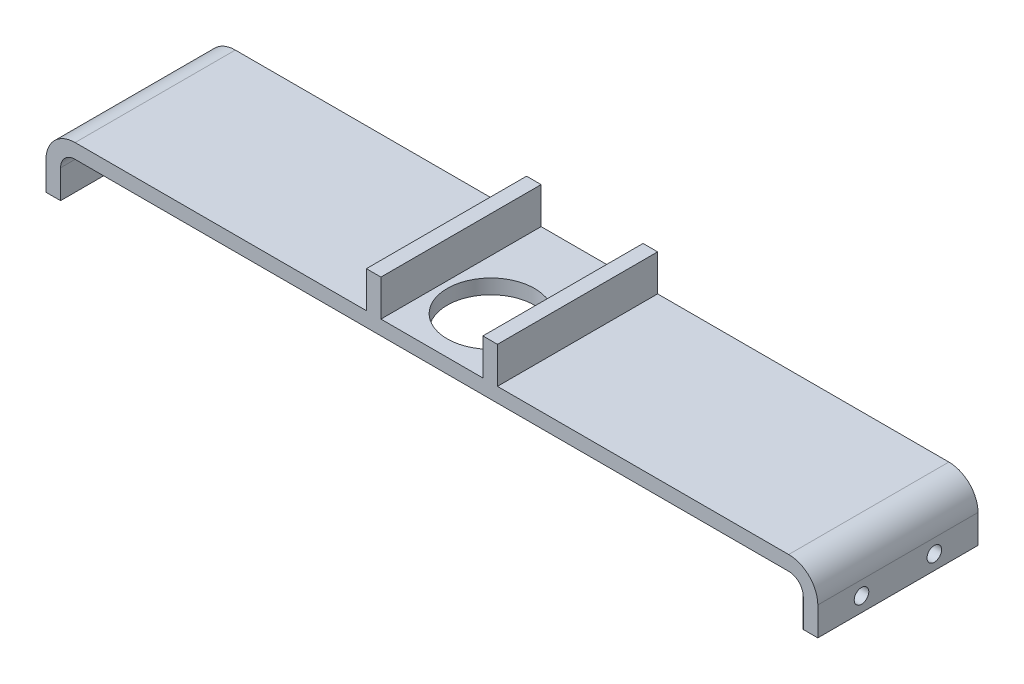
ISO-10303-21;
HEADER;
FILE_DESCRIPTION(('STEP AP214'),'2;1');
FILE_NAME('part.step','',(''),(''),'','','');
FILE_SCHEMA(('AUTOMOTIVE_DESIGN { 1 0 10303 214 1 1 1 1 }'));
ENDSEC;
DATA;
#1=APPLICATION_CONTEXT('core data for automotive mechanical design processes');
#2=APPLICATION_PROTOCOL_DEFINITION('international standard','automotive_design',2000,#1);
#3=PRODUCT_CONTEXT('',#1,'mechanical');
#4=PRODUCT('Part','Part','',(#3));
#5=PRODUCT_RELATED_PRODUCT_CATEGORY('part','',(#4));
#6=PRODUCT_DEFINITION_FORMATION('','',#4);
#7=PRODUCT_DEFINITION_CONTEXT('part definition',#1,'design');
#8=PRODUCT_DEFINITION('design','',#6,#7);
#9=PRODUCT_DEFINITION_SHAPE('','',#8);
#10=(LENGTH_UNIT() NAMED_UNIT(*) SI_UNIT(.MILLI.,.METRE.));
#11=(NAMED_UNIT(*) PLANE_ANGLE_UNIT() SI_UNIT($,.RADIAN.));
#12=(NAMED_UNIT(*) SI_UNIT($,.STERADIAN.) SOLID_ANGLE_UNIT());
#13=UNCERTAINTY_MEASURE_WITH_UNIT(LENGTH_MEASURE(1.E-05),#10,'distance_accuracy_value','');
#14=(GEOMETRIC_REPRESENTATION_CONTEXT(3) GLOBAL_UNCERTAINTY_ASSIGNED_CONTEXT((#13)) GLOBAL_UNIT_ASSIGNED_CONTEXT((#10,
#11,#12)) REPRESENTATION_CONTEXT('',''));
#15=CARTESIAN_POINT('',(0.,0.,0.));
#16=DIRECTION('',(0.,0.,1.));
#17=DIRECTION('',(1.,0.,0.));
#18=AXIS2_PLACEMENT_3D('',#15,#16,#17);
#19=CARTESIAN_POINT('',(0.,39.6,110.));
#20=DIRECTION('',(0.,1.,0.));
#21=DIRECTION('',(0.,0.,1.));
#22=AXIS2_PLACEMENT_3D('',#19,#20,#21);
#23=PLANE('',#22);
#24=DIRECTION('',(1.,0.,0.));
#25=VECTOR('',#24,1.);
#26=CARTESIAN_POINT('',(0.,39.6,110.));
#27=LINE('',#26,#25);
#28=CARTESIAN_POINT('',(20.,39.6,110.));
#29=VERTEX_POINT('',#28);
#30=CARTESIAN_POINT('',(220.,39.6,110.));
#31=VERTEX_POINT('',#30);
#32=EDGE_CURVE('E273',#29,#31,#27,.T.);
#33=ORIENTED_EDGE('',*,*,#32,.T.);
#34=DIRECTION('',(0.,0.,1.));
#35=VECTOR('',#34,1.);
#36=CARTESIAN_POINT('',(220.,39.6,0.));
#37=LINE('',#36,#35);
#38=CARTESIAN_POINT('',(220.,39.6,0.));
#39=VERTEX_POINT('',#38);
#40=EDGE_CURVE('E230',#39,#31,#37,.T.);
#41=ORIENTED_EDGE('',*,*,#40,.F.);
#42=DIRECTION('',(1.,0.,0.));
#43=VECTOR('',#42,1.);
#44=CARTESIAN_POINT('',(0.,39.6,0.));
#45=LINE('',#44,#43);
#46=CARTESIAN_POINT('',(20.,39.6,0.));
#47=VERTEX_POINT('',#46);
#48=EDGE_CURVE('E206',#47,#39,#45,.T.);
#49=ORIENTED_EDGE('',*,*,#48,.F.);
#50=DIRECTION('',(0.,0.,-1.));
#51=VECTOR('',#50,1.);
#52=CARTESIAN_POINT('',(20.,39.6,110.));
#53=LINE('',#52,#51);
#54=EDGE_CURVE('E331',#29,#47,#53,.T.);
#55=ORIENTED_EDGE('',*,*,#54,.F.);
#56=EDGE_LOOP('',(#33,#41,#49,#55));
#57=FACE_BOUND('',#56,.T.);
#58=ADVANCED_FACE('F43',(#57),#23,.T.);
#59=CARTESIAN_POINT('',(264.500885843374,39.6,69.));
#60=DIRECTION('',(0.,1.,0.));
#61=DIRECTION('',(0.,0.,1.));
#62=AXIS2_PLACEMENT_3D('',#59,#60,#61);
#63=CIRCLE('',#62,30.);
#64=CARTESIAN_POINT('',(264.500885843374,39.6,99.0000000000001));
#65=VERTEX_POINT('',#64);
#66=EDGE_CURVE('E519',#65,#65,#63,.T.);
#67=ORIENTED_EDGE('',*,*,#66,.F.);
#68=EDGE_LOOP('',(#67));
#69=FACE_BOUND('',#68,.T.);
#70=CARTESIAN_POINT('',(230.,39.6,0.));
#71=VERTEX_POINT('',#70);
#72=CARTESIAN_POINT('',(300.,39.6,0.));
#73=VERTEX_POINT('',#72);
#74=EDGE_CURVE('E308',#71,#73,#45,.T.);
#75=ORIENTED_EDGE('',*,*,#74,.F.);
#76=DIRECTION('',(0.,0.,-1.));
#77=VECTOR('',#76,1.);
#78=CARTESIAN_POINT('',(230.,39.6,0.));
#79=LINE('',#78,#77);
#80=CARTESIAN_POINT('',(230.,39.6,110.));
#81=VERTEX_POINT('',#80);
#82=EDGE_CURVE('E199',#81,#71,#79,.T.);
#83=ORIENTED_EDGE('',*,*,#82,.F.);
#84=CARTESIAN_POINT('',(300.,39.6,110.));
#85=VERTEX_POINT('',#84);
#86=EDGE_CURVE('E277',#81,#85,#27,.T.);
#87=ORIENTED_EDGE('',*,*,#86,.T.);
#88=DIRECTION('',(0.,0.,-1.));
#89=VECTOR('',#88,1.);
#90=CARTESIAN_POINT('',(300.,39.6,110.));
#91=LINE('',#90,#89);
#92=EDGE_CURVE('E225',#85,#73,#91,.T.);
#93=ORIENTED_EDGE('',*,*,#92,.T.);
#94=EDGE_LOOP('',(#75,#83,#87,#93));
#95=FACE_BOUND('',#94,.T.);
#96=ADVANCED_FACE('F397',(#69,#95),#23,.T.);
#97=DIRECTION('',(0.,0.,1.));
#98=VECTOR('',#97,1.);
#99=CARTESIAN_POINT('',(310.,39.6,0.));
#100=LINE('',#99,#98);
#101=CARTESIAN_POINT('',(310.,39.6,0.));
#102=VERTEX_POINT('',#101);
#103=CARTESIAN_POINT('',(310.,39.6,110.));
#104=VERTEX_POINT('',#103);
#105=EDGE_CURVE('E60',#102,#104,#100,.T.);
#106=ORIENTED_EDGE('',*,*,#105,.T.);
#107=CARTESIAN_POINT('',(510.,39.6,110.));
#108=VERTEX_POINT('',#107);
#109=EDGE_CURVE('E272',#104,#108,#27,.T.);
#110=ORIENTED_EDGE('',*,*,#109,.T.);
#111=DIRECTION('',(0.,0.,-1.));
#112=VECTOR('',#111,1.);
#113=CARTESIAN_POINT('',(510.,39.6,110.));
#114=LINE('',#113,#112);
#115=CARTESIAN_POINT('',(510.,39.6,0.));
#116=VERTEX_POINT('',#115);
#117=EDGE_CURVE('E333',#108,#116,#114,.T.);
#118=ORIENTED_EDGE('',*,*,#117,.T.);
#119=EDGE_CURVE('E305',#102,#116,#45,.T.);
#120=ORIENTED_EDGE('',*,*,#119,.F.);
#121=EDGE_LOOP('',(#106,#110,#118,#120));
#122=FACE_BOUND('',#121,.T.);
#123=ADVANCED_FACE('F403',(#122),#23,.T.);
#124=CARTESIAN_POINT('',(0.,29.6,110.));
#125=DIRECTION('',(0.,1.,0.));
#126=DIRECTION('',(0.,0.,1.));
#127=AXIS2_PLACEMENT_3D('',#124,#125,#126);
#128=PLANE('',#127);
#129=CARTESIAN_POINT('',(264.500885843374,29.6,69.));
#130=DIRECTION('',(0.,1.,0.));
#131=DIRECTION('',(0.,0.,1.));
#132=AXIS2_PLACEMENT_3D('',#129,#130,#131);
#133=CIRCLE('',#132,30.);
#134=CARTESIAN_POINT('',(264.500885843374,29.6,99.0000000000001));
#135=VERTEX_POINT('',#134);
#136=EDGE_CURVE('E47',#135,#135,#133,.T.);
#137=ORIENTED_EDGE('',*,*,#136,.T.);
#138=EDGE_LOOP('',(#137));
#139=FACE_BOUND('',#138,.T.);
#140=DIRECTION('',(1.,0.,0.));
#141=VECTOR('',#140,1.);
#142=CARTESIAN_POINT('',(0.,29.6,0.));
#143=LINE('',#142,#141);
#144=CARTESIAN_POINT('',(20.,29.6,0.));
#145=VERTEX_POINT('',#144);
#146=CARTESIAN_POINT('',(510.,29.6,0.));
#147=VERTEX_POINT('',#146);
#148=EDGE_CURVE('E256',#145,#147,#143,.T.);
#149=ORIENTED_EDGE('',*,*,#148,.T.);
#150=DIRECTION('',(0.,0.,-1.));
#151=VECTOR('',#150,1.);
#152=CARTESIAN_POINT('',(510.,29.6,110.));
#153=LINE('',#152,#151);
#154=CARTESIAN_POINT('',(510.,29.6,110.));
#155=VERTEX_POINT('',#154);
#156=EDGE_CURVE('E11',#155,#147,#153,.T.);
#157=ORIENTED_EDGE('',*,*,#156,.F.);
#158=DIRECTION('',(1.,0.,0.));
#159=VECTOR('',#158,1.);
#160=CARTESIAN_POINT('',(0.,29.6,110.));
#161=LINE('',#160,#159);
#162=CARTESIAN_POINT('',(20.,29.6,110.));
#163=VERTEX_POINT('',#162);
#164=EDGE_CURVE('E257',#163,#155,#161,.T.);
#165=ORIENTED_EDGE('',*,*,#164,.F.);
#166=DIRECTION('',(0.,0.,-1.));
#167=VECTOR('',#166,1.);
#168=CARTESIAN_POINT('',(20.,29.6,110.));
#169=LINE('',#168,#167);
#170=EDGE_CURVE('E290',#163,#145,#169,.T.);
#171=ORIENTED_EDGE('',*,*,#170,.T.);
#172=EDGE_LOOP('',(#149,#157,#165,#171));
#173=FACE_BOUND('',#172,.T.);
#174=ADVANCED_FACE('F45',(#139,#173),#128,.F.);
#175=CARTESIAN_POINT('',(510.,19.6,110.));
#176=DIRECTION('',(0.,0.,-1.));
#177=DIRECTION('',(-1.,0.,0.));
#178=AXIS2_PLACEMENT_3D('',#175,#176,#177);
#179=CYLINDRICAL_SURFACE('',#178,10.);
#180=CARTESIAN_POINT('',(510.,19.6,0.));
#181=DIRECTION('',(0.,0.,1.));
#182=DIRECTION('',(1.,0.,0.));
#183=AXIS2_PLACEMENT_3D('',#180,#181,#182);
#184=CIRCLE('',#183,10.);
#185=CARTESIAN_POINT('',(520.,19.6,0.));
#186=VERTEX_POINT('',#185);
#187=EDGE_CURVE('E293',#147,#186,#184,.F.);
#188=ORIENTED_EDGE('',*,*,#187,.T.);
#189=DIRECTION('',(0.,0.,-1.));
#190=VECTOR('',#189,1.);
#191=CARTESIAN_POINT('',(520.,19.6,110.));
#192=LINE('',#191,#190);
#193=CARTESIAN_POINT('',(520.,19.6,110.));
#194=VERTEX_POINT('',#193);
#195=EDGE_CURVE('E52',#194,#186,#192,.T.);
#196=ORIENTED_EDGE('',*,*,#195,.F.);
#197=CARTESIAN_POINT('',(510.,19.6,110.));
#198=DIRECTION('',(0.,0.,1.));
#199=DIRECTION('',(1.,0.,0.));
#200=AXIS2_PLACEMENT_3D('',#197,#198,#199);
#201=CIRCLE('',#200,10.);
#202=EDGE_CURVE('E260',#155,#194,#201,.F.);
#203=ORIENTED_EDGE('',*,*,#202,.F.);
#204=ORIENTED_EDGE('',*,*,#156,.T.);
#205=EDGE_LOOP('',(#188,#196,#203,#204));
#206=FACE_BOUND('',#205,.T.);
#207=ADVANCED_FACE('F452',(#206),#179,.F.);
#208=CARTESIAN_POINT('',(520.,0.,110.));
#209=DIRECTION('',(1.,0.,0.));
#210=DIRECTION('',(0.,0.,-1.));
#211=AXIS2_PLACEMENT_3D('',#208,#209,#210);
#212=PLANE('',#211);
#213=CARTESIAN_POINT('',(520.,9.99999999999999,30.));
#214=DIRECTION('',(1.,0.,0.));
#215=DIRECTION('',(0.,0.,-1.));
#216=AXIS2_PLACEMENT_3D('',#213,#214,#215);
#217=CIRCLE('',#216,5.);
#218=CARTESIAN_POINT('',(520.,9.99999999999999,25.));
#219=VERTEX_POINT('',#218);
#220=EDGE_CURVE('E253',#219,#219,#217,.T.);
#221=ORIENTED_EDGE('',*,*,#220,.T.);
#222=EDGE_LOOP('',(#221));
#223=FACE_BOUND('',#222,.T.);
#224=CARTESIAN_POINT('',(520.,9.99999999999999,80.));
#225=DIRECTION('',(1.,0.,0.));
#226=DIRECTION('',(0.,0.,-1.));
#227=AXIS2_PLACEMENT_3D('',#224,#225,#226);
#228=CIRCLE('',#227,4.99999999999999);
#229=CARTESIAN_POINT('',(520.,9.99999999999999,75.));
#230=VERTEX_POINT('',#229);
#231=EDGE_CURVE('E249',#230,#230,#228,.T.);
#232=ORIENTED_EDGE('',*,*,#231,.T.);
#233=EDGE_LOOP('',(#232));
#234=FACE_BOUND('',#233,.T.);
#235=DIRECTION('',(0.,-1.,0.));
#236=VECTOR('',#235,1.);
#237=CARTESIAN_POINT('',(520.,0.,0.));
#238=LINE('',#237,#236);
#239=CARTESIAN_POINT('',(520.,0.,0.));
#240=VERTEX_POINT('',#239);
#241=EDGE_CURVE('E295',#186,#240,#238,.T.);
#242=ORIENTED_EDGE('',*,*,#241,.T.);
#243=DIRECTION('',(0.,0.,-1.));
#244=VECTOR('',#243,1.);
#245=CARTESIAN_POINT('',(520.,0.,110.));
#246=LINE('',#245,#244);
#247=CARTESIAN_POINT('',(520.,0.,110.));
#248=VERTEX_POINT('',#247);
#249=EDGE_CURVE('E341',#248,#240,#246,.T.);
#250=ORIENTED_EDGE('',*,*,#249,.F.);
#251=DIRECTION('',(0.,-1.,0.));
#252=VECTOR('',#251,1.);
#253=CARTESIAN_POINT('',(520.,0.,110.));
#254=LINE('',#253,#252);
#255=EDGE_CURVE('E263',#194,#248,#254,.T.);
#256=ORIENTED_EDGE('',*,*,#255,.F.);
#257=ORIENTED_EDGE('',*,*,#195,.T.);
#258=EDGE_LOOP('',(#242,#250,#256,#257));
#259=FACE_BOUND('',#258,.T.);
#260=ADVANCED_FACE('F458',(#223,#234,#259),#212,.F.);
#261=CARTESIAN_POINT('',(0.,0.,110.));
#262=DIRECTION('',(0.,1.,0.));
#263=DIRECTION('',(0.,0.,1.));
#264=AXIS2_PLACEMENT_3D('',#261,#262,#263);
#265=PLANE('',#264);
#266=DIRECTION('',(1.,0.,0.));
#267=VECTOR('',#266,1.);
#268=CARTESIAN_POINT('',(0.,0.,0.));
#269=LINE('',#268,#267);
#270=CARTESIAN_POINT('',(530.,0.,0.));
#271=VERTEX_POINT('',#270);
#272=EDGE_CURVE('E297',#240,#271,#269,.T.);
#273=ORIENTED_EDGE('',*,*,#272,.T.);
#274=DIRECTION('',(0.,0.,-1.));
#275=VECTOR('',#274,1.);
#276=CARTESIAN_POINT('',(530.,0.,110.));
#277=LINE('',#276,#275);
#278=CARTESIAN_POINT('',(530.,0.,110.));
#279=VERTEX_POINT('',#278);
#280=EDGE_CURVE('E338',#279,#271,#277,.T.);
#281=ORIENTED_EDGE('',*,*,#280,.F.);
#282=DIRECTION('',(1.,0.,0.));
#283=VECTOR('',#282,1.);
#284=CARTESIAN_POINT('',(0.,0.,110.));
#285=LINE('',#284,#283);
#286=EDGE_CURVE('E265',#248,#279,#285,.T.);
#287=ORIENTED_EDGE('',*,*,#286,.F.);
#288=ORIENTED_EDGE('',*,*,#249,.T.);
#289=EDGE_LOOP('',(#273,#281,#287,#288));
#290=FACE_BOUND('',#289,.T.);
#291=ADVANCED_FACE('F469',(#290),#265,.F.);
#292=CARTESIAN_POINT('',(530.,0.,110.));
#293=DIRECTION('',(-1.,0.,0.));
#294=DIRECTION('',(0.,0.,1.));
#295=AXIS2_PLACEMENT_3D('',#292,#293,#294);
#296=PLANE('',#295);
#297=CARTESIAN_POINT('',(530.,9.99999999999999,30.));
#298=DIRECTION('',(-1.,0.,0.));
#299=DIRECTION('',(0.,0.,1.));
#300=AXIS2_PLACEMENT_3D('',#297,#298,#299);
#301=CIRCLE('',#300,5.);
#302=CARTESIAN_POINT('',(530.,9.99999999999999,35.));
#303=VERTEX_POINT('',#302);
#304=EDGE_CURVE('E240',#303,#303,#301,.T.);
#305=ORIENTED_EDGE('',*,*,#304,.T.);
#306=EDGE_LOOP('',(#305));
#307=FACE_BOUND('',#306,.T.);
#308=CARTESIAN_POINT('',(530.,9.99999999999999,80.));
#309=DIRECTION('',(-1.,0.,0.));
#310=DIRECTION('',(0.,0.,-1.));
#311=AXIS2_PLACEMENT_3D('',#308,#309,#310);
#312=CIRCLE('',#311,4.99999999999999);
#313=CARTESIAN_POINT('',(530.,9.99999999999999,75.));
#314=VERTEX_POINT('',#313);
#315=EDGE_CURVE('E207',#314,#314,#312,.T.);
#316=ORIENTED_EDGE('',*,*,#315,.T.);
#317=EDGE_LOOP('',(#316));
#318=FACE_BOUND('',#317,.T.);
#319=DIRECTION('',(0.,1.,0.));
#320=VECTOR('',#319,1.);
#321=CARTESIAN_POINT('',(530.,0.,0.));
#322=LINE('',#321,#320);
#323=CARTESIAN_POINT('',(530.,19.6,0.));
#324=VERTEX_POINT('',#323);
#325=EDGE_CURVE('E299',#271,#324,#322,.T.);
#326=ORIENTED_EDGE('',*,*,#325,.T.);
#327=DIRECTION('',(0.,0.,-1.));
#328=VECTOR('',#327,1.);
#329=CARTESIAN_POINT('',(530.,19.6,110.));
#330=LINE('',#329,#328);
#331=CARTESIAN_POINT('',(530.,19.6,110.));
#332=VERTEX_POINT('',#331);
#333=EDGE_CURVE('E336',#332,#324,#330,.T.);
#334=ORIENTED_EDGE('',*,*,#333,.F.);
#335=DIRECTION('',(0.,1.,0.));
#336=VECTOR('',#335,1.);
#337=CARTESIAN_POINT('',(530.,0.,110.));
#338=LINE('',#337,#336);
#339=EDGE_CURVE('E267',#279,#332,#338,.T.);
#340=ORIENTED_EDGE('',*,*,#339,.F.);
#341=ORIENTED_EDGE('',*,*,#280,.T.);
#342=EDGE_LOOP('',(#326,#334,#340,#341));
#343=FACE_BOUND('',#342,.T.);
#344=ADVANCED_FACE('F415',(#307,#318,#343),#296,.F.);
#345=CARTESIAN_POINT('',(510.,19.6,110.));
#346=DIRECTION('',(0.,0.,-1.));
#347=DIRECTION('',(-1.,0.,0.));
#348=AXIS2_PLACEMENT_3D('',#345,#346,#347);
#349=CYLINDRICAL_SURFACE('',#348,20.);
#350=CARTESIAN_POINT('',(510.,19.6,0.));
#351=DIRECTION('',(0.,0.,1.));
#352=DIRECTION('',(1.,0.,0.));
#353=AXIS2_PLACEMENT_3D('',#350,#351,#352);
#354=CIRCLE('',#353,20.);
#355=EDGE_CURVE('E302',#116,#324,#354,.F.);
#356=ORIENTED_EDGE('',*,*,#355,.F.);
#357=ORIENTED_EDGE('',*,*,#117,.F.);
#358=CARTESIAN_POINT('',(510.,19.6,110.));
#359=DIRECTION('',(0.,0.,1.));
#360=DIRECTION('',(1.,0.,0.));
#361=AXIS2_PLACEMENT_3D('',#358,#359,#360);
#362=CIRCLE('',#361,20.);
#363=EDGE_CURVE('E269',#108,#332,#362,.F.);
#364=ORIENTED_EDGE('',*,*,#363,.T.);
#365=ORIENTED_EDGE('',*,*,#333,.T.);
#366=EDGE_LOOP('',(#356,#357,#364,#365));
#367=FACE_BOUND('',#366,.T.);
#368=ADVANCED_FACE('F409',(#367),#349,.T.);
#369=CARTESIAN_POINT('',(20.,19.6,110.));
#370=DIRECTION('',(0.,0.,-1.));
#371=DIRECTION('',(-1.,0.,0.));
#372=AXIS2_PLACEMENT_3D('',#369,#370,#371);
#373=CYLINDRICAL_SURFACE('',#372,20.);
#374=CARTESIAN_POINT('',(20.,19.6,0.));
#375=DIRECTION('',(0.,0.,1.));
#376=DIRECTION('',(1.,0.,0.));
#377=AXIS2_PLACEMENT_3D('',#374,#375,#376);
#378=CIRCLE('',#377,20.);
#379=CARTESIAN_POINT('',(0.,19.6,0.));
#380=VERTEX_POINT('',#379);
#381=EDGE_CURVE('E307',#47,#380,#378,.T.);
#382=ORIENTED_EDGE('',*,*,#381,.T.);
#383=DIRECTION('',(0.,0.,-1.));
#384=VECTOR('',#383,1.);
#385=CARTESIAN_POINT('',(0.,19.6,110.));
#386=LINE('',#385,#384);
#387=CARTESIAN_POINT('',(0.,19.6,110.));
#388=VERTEX_POINT('',#387);
#389=EDGE_CURVE('E329',#388,#380,#386,.T.);
#390=ORIENTED_EDGE('',*,*,#389,.F.);
#391=CARTESIAN_POINT('',(20.,19.6,110.));
#392=DIRECTION('',(0.,0.,1.));
#393=DIRECTION('',(1.,0.,0.));
#394=AXIS2_PLACEMENT_3D('',#391,#392,#393);
#395=CIRCLE('',#394,20.);
#396=EDGE_CURVE('E276',#29,#388,#395,.T.);
#397=ORIENTED_EDGE('',*,*,#396,.F.);
#398=ORIENTED_EDGE('',*,*,#54,.T.);
#399=EDGE_LOOP('',(#382,#390,#397,#398));
#400=FACE_BOUND('',#399,.T.);
#401=ADVANCED_FACE('F381',(#400),#373,.T.);
#402=CARTESIAN_POINT('',(0.,0.,110.));
#403=DIRECTION('',(-1.,0.,0.));
#404=DIRECTION('',(0.,0.,1.));
#405=AXIS2_PLACEMENT_3D('',#402,#403,#404);
#406=PLANE('',#405);
#407=CARTESIAN_POINT('',(0.,9.99999999999999,30.));
#408=DIRECTION('',(-1.,0.,0.));
#409=DIRECTION('',(0.,0.,1.));
#410=AXIS2_PLACEMENT_3D('',#407,#408,#409);
#411=CIRCLE('',#410,5.);
#412=CARTESIAN_POINT('',(0.,9.99999999999999,35.));
#413=VERTEX_POINT('',#412);
#414=EDGE_CURVE('E244',#413,#413,#411,.T.);
#415=ORIENTED_EDGE('',*,*,#414,.F.);
#416=EDGE_LOOP('',(#415));
#417=FACE_BOUND('',#416,.T.);
#418=CARTESIAN_POINT('',(0.,9.99999999999999,80.));
#419=DIRECTION('',(-1.,0.,0.));
#420=DIRECTION('',(0.,0.,-1.));
#421=AXIS2_PLACEMENT_3D('',#418,#419,#420);
#422=CIRCLE('',#421,4.99999999999999);
#423=CARTESIAN_POINT('',(0.,9.99999999999999,75.));
#424=VERTEX_POINT('',#423);
#425=EDGE_CURVE('E210',#424,#424,#422,.T.);
#426=ORIENTED_EDGE('',*,*,#425,.F.);
#427=EDGE_LOOP('',(#426));
#428=FACE_BOUND('',#427,.T.);
#429=DIRECTION('',(0.,1.,0.));
#430=VECTOR('',#429,1.);
#431=CARTESIAN_POINT('',(0.,0.,0.));
#432=LINE('',#431,#430);
#433=CARTESIAN_POINT('',(0.,0.,0.));
#434=VERTEX_POINT('',#433);
#435=EDGE_CURVE('E311',#434,#380,#432,.T.);
#436=ORIENTED_EDGE('',*,*,#435,.F.);
#437=DIRECTION('',(0.,0.,-1.));
#438=VECTOR('',#437,1.);
#439=CARTESIAN_POINT('',(0.,0.,110.));
#440=LINE('',#439,#438);
#441=CARTESIAN_POINT('',(0.,0.,110.));
#442=VERTEX_POINT('',#441);
#443=EDGE_CURVE('E327',#442,#434,#440,.T.);
#444=ORIENTED_EDGE('',*,*,#443,.F.);
#445=DIRECTION('',(0.,1.,0.));
#446=VECTOR('',#445,1.);
#447=CARTESIAN_POINT('',(0.,0.,110.));
#448=LINE('',#447,#446);
#449=EDGE_CURVE('E279',#442,#388,#448,.T.);
#450=ORIENTED_EDGE('',*,*,#449,.T.);
#451=ORIENTED_EDGE('',*,*,#389,.T.);
#452=EDGE_LOOP('',(#436,#444,#450,#451));
#453=FACE_BOUND('',#452,.T.);
#454=ADVANCED_FACE('F377',(#417,#428,#453),#406,.T.);
#455=CARTESIAN_POINT('',(0.,0.,110.));
#456=DIRECTION('',(0.,1.,0.));
#457=DIRECTION('',(0.,0.,1.));
#458=AXIS2_PLACEMENT_3D('',#455,#456,#457);
#459=PLANE('',#458);
#460=DIRECTION('',(1.,0.,0.));
#461=VECTOR('',#460,1.);
#462=CARTESIAN_POINT('',(0.,0.,0.));
#463=LINE('',#462,#461);
#464=CARTESIAN_POINT('',(10.,0.,0.));
#465=VERTEX_POINT('',#464);
#466=EDGE_CURVE('E314',#434,#465,#463,.T.);
#467=ORIENTED_EDGE('',*,*,#466,.T.);
#468=DIRECTION('',(0.,0.,-1.));
#469=VECTOR('',#468,1.);
#470=CARTESIAN_POINT('',(10.,0.,110.));
#471=LINE('',#470,#469);
#472=CARTESIAN_POINT('',(10.,0.,110.));
#473=VERTEX_POINT('',#472);
#474=EDGE_CURVE('E325',#473,#465,#471,.T.);
#475=ORIENTED_EDGE('',*,*,#474,.F.);
#476=DIRECTION('',(1.,0.,0.));
#477=VECTOR('',#476,1.);
#478=CARTESIAN_POINT('',(0.,0.,110.));
#479=LINE('',#478,#477);
#480=EDGE_CURVE('E282',#442,#473,#479,.T.);
#481=ORIENTED_EDGE('',*,*,#480,.F.);
#482=ORIENTED_EDGE('',*,*,#443,.T.);
#483=EDGE_LOOP('',(#467,#475,#481,#482));
#484=FACE_BOUND('',#483,.T.);
#485=ADVANCED_FACE('F357',(#484),#459,.F.);
#486=CARTESIAN_POINT('',(10.,0.,110.));
#487=DIRECTION('',(1.,0.,0.));
#488=DIRECTION('',(0.,0.,-1.));
#489=AXIS2_PLACEMENT_3D('',#486,#487,#488);
#490=PLANE('',#489);
#491=CARTESIAN_POINT('',(10.,9.99999999999999,30.));
#492=DIRECTION('',(1.,0.,0.));
#493=DIRECTION('',(0.,0.,-1.));
#494=AXIS2_PLACEMENT_3D('',#491,#492,#493);
#495=CIRCLE('',#494,5.);
#496=CARTESIAN_POINT('',(10.,9.99999999999999,25.));
#497=VERTEX_POINT('',#496);
#498=EDGE_CURVE('E252',#497,#497,#495,.T.);
#499=ORIENTED_EDGE('',*,*,#498,.F.);
#500=EDGE_LOOP('',(#499));
#501=FACE_BOUND('',#500,.T.);
#502=CARTESIAN_POINT('',(10.,9.99999999999999,80.));
#503=DIRECTION('',(1.,0.,0.));
#504=DIRECTION('',(0.,0.,-1.));
#505=AXIS2_PLACEMENT_3D('',#502,#503,#504);
#506=CIRCLE('',#505,4.99999999999999);
#507=CARTESIAN_POINT('',(10.,9.99999999999999,75.));
#508=VERTEX_POINT('',#507);
#509=EDGE_CURVE('E243',#508,#508,#506,.T.);
#510=ORIENTED_EDGE('',*,*,#509,.F.);
#511=EDGE_LOOP('',(#510));
#512=FACE_BOUND('',#511,.T.);
#513=DIRECTION('',(0.,-1.,0.));
#514=VECTOR('',#513,1.);
#515=CARTESIAN_POINT('',(10.,0.,0.));
#516=LINE('',#515,#514);
#517=CARTESIAN_POINT('',(10.,19.6,0.));
#518=VERTEX_POINT('',#517);
#519=EDGE_CURVE('E317',#518,#465,#516,.T.);
#520=ORIENTED_EDGE('',*,*,#519,.F.);
#521=DIRECTION('',(0.,0.,-1.));
#522=VECTOR('',#521,1.);
#523=CARTESIAN_POINT('',(10.,19.6,110.));
#524=LINE('',#523,#522);
#525=CARTESIAN_POINT('',(10.,19.6,110.));
#526=VERTEX_POINT('',#525);
#527=EDGE_CURVE('E323',#526,#518,#524,.T.);
#528=ORIENTED_EDGE('',*,*,#527,.F.);
#529=DIRECTION('',(0.,-1.,0.));
#530=VECTOR('',#529,1.);
#531=CARTESIAN_POINT('',(10.,0.,110.));
#532=LINE('',#531,#530);
#533=EDGE_CURVE('E284',#526,#473,#532,.T.);
#534=ORIENTED_EDGE('',*,*,#533,.T.);
#535=ORIENTED_EDGE('',*,*,#474,.T.);
#536=EDGE_LOOP('',(#520,#528,#534,#535));
#537=FACE_BOUND('',#536,.T.);
#538=ADVANCED_FACE('F353',(#501,#512,#537),#490,.T.);
#539=CARTESIAN_POINT('',(20.,19.6,110.));
#540=DIRECTION('',(0.,0.,-1.));
#541=DIRECTION('',(-1.,0.,0.));
#542=AXIS2_PLACEMENT_3D('',#539,#540,#541);
#543=CYLINDRICAL_SURFACE('',#542,10.);
#544=CARTESIAN_POINT('',(20.,19.6,0.));
#545=DIRECTION('',(0.,0.,1.));
#546=DIRECTION('',(1.,0.,0.));
#547=AXIS2_PLACEMENT_3D('',#544,#545,#546);
#548=CIRCLE('',#547,10.);
#549=EDGE_CURVE('E261',#145,#518,#548,.T.);
#550=ORIENTED_EDGE('',*,*,#549,.F.);
#551=ORIENTED_EDGE('',*,*,#170,.F.);
#552=CARTESIAN_POINT('',(20.,19.6,110.));
#553=DIRECTION('',(0.,0.,1.));
#554=DIRECTION('',(1.,0.,0.));
#555=AXIS2_PLACEMENT_3D('',#552,#553,#554);
#556=CIRCLE('',#555,10.);
#557=EDGE_CURVE('E287',#163,#526,#556,.T.);
#558=ORIENTED_EDGE('',*,*,#557,.T.);
#559=ORIENTED_EDGE('',*,*,#527,.T.);
#560=EDGE_LOOP('',(#550,#551,#558,#559));
#561=FACE_BOUND('',#560,.T.);
#562=ADVANCED_FACE('F356',(#561),#543,.F.);
#563=CARTESIAN_POINT('',(0.,0.,110.));
#564=DIRECTION('',(0.,0.,1.));
#565=DIRECTION('',(1.,0.,0.));
#566=AXIS2_PLACEMENT_3D('',#563,#564,#565);
#567=PLANE('',#566);
#568=ORIENTED_EDGE('',*,*,#164,.T.);
#569=ORIENTED_EDGE('',*,*,#202,.T.);
#570=ORIENTED_EDGE('',*,*,#255,.T.);
#571=ORIENTED_EDGE('',*,*,#286,.T.);
#572=ORIENTED_EDGE('',*,*,#339,.T.);
#573=ORIENTED_EDGE('',*,*,#363,.F.);
#574=ORIENTED_EDGE('',*,*,#109,.F.);
#575=DIRECTION('',(0.,-1.,0.));
#576=VECTOR('',#575,1.);
#577=CARTESIAN_POINT('',(310.,64.6,110.));
#578=LINE('',#577,#576);
#579=CARTESIAN_POINT('',(310.,64.6,110.));
#580=VERTEX_POINT('',#579);
#581=EDGE_CURVE('E216',#580,#104,#578,.T.);
#582=ORIENTED_EDGE('',*,*,#581,.F.);
#583=DIRECTION('',(1.,0.,0.));
#584=VECTOR('',#583,1.);
#585=CARTESIAN_POINT('',(300.,64.6,110.));
#586=LINE('',#585,#584);
#587=CARTESIAN_POINT('',(300.,64.6,110.));
#588=VERTEX_POINT('',#587);
#589=EDGE_CURVE('E228',#588,#580,#586,.T.);
#590=ORIENTED_EDGE('',*,*,#589,.F.);
#591=DIRECTION('',(0.,-1.,0.));
#592=VECTOR('',#591,1.);
#593=CARTESIAN_POINT('',(300.,64.6,110.));
#594=LINE('',#593,#592);
#595=EDGE_CURVE('E222',#588,#85,#594,.T.);
#596=ORIENTED_EDGE('',*,*,#595,.T.);
#597=ORIENTED_EDGE('',*,*,#86,.F.);
#598=DIRECTION('',(0.,-1.,0.));
#599=VECTOR('',#598,1.);
#600=CARTESIAN_POINT('',(230.,64.6,110.));
#601=LINE('',#600,#599);
#602=CARTESIAN_POINT('',(230.,64.6,110.));
#603=VERTEX_POINT('',#602);
#604=EDGE_CURVE('E212',#603,#81,#601,.T.);
#605=ORIENTED_EDGE('',*,*,#604,.F.);
#606=DIRECTION('',(1.,0.,0.));
#607=VECTOR('',#606,1.);
#608=CARTESIAN_POINT('',(0.,64.6,110.));
#609=LINE('',#608,#607);
#610=CARTESIAN_POINT('',(220.,64.6,110.));
#611=VERTEX_POINT('',#610);
#612=EDGE_CURVE('E193',#611,#603,#609,.T.);
#613=ORIENTED_EDGE('',*,*,#612,.F.);
#614=DIRECTION('',(0.,-1.,0.));
#615=VECTOR('',#614,1.);
#616=CARTESIAN_POINT('',(220.,64.6,110.));
#617=LINE('',#616,#615);
#618=EDGE_CURVE('E190',#611,#31,#617,.T.);
#619=ORIENTED_EDGE('',*,*,#618,.T.);
#620=ORIENTED_EDGE('',*,*,#32,.F.);
#621=ORIENTED_EDGE('',*,*,#396,.T.);
#622=ORIENTED_EDGE('',*,*,#449,.F.);
#623=ORIENTED_EDGE('',*,*,#480,.T.);
#624=ORIENTED_EDGE('',*,*,#533,.F.);
#625=ORIENTED_EDGE('',*,*,#557,.F.);
#626=EDGE_LOOP('',(#568,#569,#570,#571,#572,#573,#574,#582,#590,#596,#597,#605,#613,#619,#620,
#621,#622,#623,#624,#625));
#627=FACE_BOUND('',#626,.T.);
#628=ADVANCED_FACE('F370',(#627),#567,.T.);
#629=CARTESIAN_POINT('',(0.,0.,0.));
#630=DIRECTION('',(0.,0.,1.));
#631=DIRECTION('',(1.,0.,0.));
#632=AXIS2_PLACEMENT_3D('',#629,#630,#631);
#633=PLANE('',#632);
#634=ORIENTED_EDGE('',*,*,#148,.F.);
#635=ORIENTED_EDGE('',*,*,#549,.T.);
#636=ORIENTED_EDGE('',*,*,#519,.T.);
#637=ORIENTED_EDGE('',*,*,#466,.F.);
#638=ORIENTED_EDGE('',*,*,#435,.T.);
#639=ORIENTED_EDGE('',*,*,#381,.F.);
#640=ORIENTED_EDGE('',*,*,#48,.T.);
#641=DIRECTION('',(0.,-1.,0.));
#642=VECTOR('',#641,1.);
#643=CARTESIAN_POINT('',(220.,64.6,0.));
#644=LINE('',#643,#642);
#645=CARTESIAN_POINT('',(220.,64.6,0.));
#646=VERTEX_POINT('',#645);
#647=EDGE_CURVE('E187',#646,#39,#644,.T.);
#648=ORIENTED_EDGE('',*,*,#647,.F.);
#649=DIRECTION('',(-1.,0.,0.));
#650=VECTOR('',#649,1.);
#651=CARTESIAN_POINT('',(0.,64.6,0.));
#652=LINE('',#651,#650);
#653=CARTESIAN_POINT('',(230.,64.6,0.));
#654=VERTEX_POINT('',#653);
#655=EDGE_CURVE('E194',#654,#646,#652,.T.);
#656=ORIENTED_EDGE('',*,*,#655,.F.);
#657=DIRECTION('',(0.,-1.,0.));
#658=VECTOR('',#657,1.);
#659=CARTESIAN_POINT('',(230.,64.6,0.));
#660=LINE('',#659,#658);
#661=EDGE_CURVE('E68',#654,#71,#660,.T.);
#662=ORIENTED_EDGE('',*,*,#661,.T.);
#663=ORIENTED_EDGE('',*,*,#74,.T.);
#664=DIRECTION('',(0.,-1.,0.));
#665=VECTOR('',#664,1.);
#666=CARTESIAN_POINT('',(300.,64.6,0.));
#667=LINE('',#666,#665);
#668=CARTESIAN_POINT('',(300.,64.6,0.));
#669=VERTEX_POINT('',#668);
#670=EDGE_CURVE('E220',#669,#73,#667,.T.);
#671=ORIENTED_EDGE('',*,*,#670,.F.);
#672=DIRECTION('',(1.,0.,0.));
#673=VECTOR('',#672,1.);
#674=CARTESIAN_POINT('',(300.,64.6,0.));
#675=LINE('',#674,#673);
#676=CARTESIAN_POINT('',(310.,64.6,0.));
#677=VERTEX_POINT('',#676);
#678=EDGE_CURVE('E233',#669,#677,#675,.T.);
#679=ORIENTED_EDGE('',*,*,#678,.T.);
#680=DIRECTION('',(0.,-1.,0.));
#681=VECTOR('',#680,1.);
#682=CARTESIAN_POINT('',(310.,64.6,0.));
#683=LINE('',#682,#681);
#684=EDGE_CURVE('E218',#677,#102,#683,.T.);
#685=ORIENTED_EDGE('',*,*,#684,.T.);
#686=ORIENTED_EDGE('',*,*,#119,.T.);
#687=ORIENTED_EDGE('',*,*,#355,.T.);
#688=ORIENTED_EDGE('',*,*,#325,.F.);
#689=ORIENTED_EDGE('',*,*,#272,.F.);
#690=ORIENTED_EDGE('',*,*,#241,.F.);
#691=ORIENTED_EDGE('',*,*,#187,.F.);
#692=EDGE_LOOP('',(#634,#635,#636,#637,#638,#639,#640,#648,#656,#662,#663,#671,#679,#685,#686,
#687,#688,#689,#690,#691));
#693=FACE_BOUND('',#692,.T.);
#694=ADVANCED_FACE('F203',(#693),#633,.F.);
#695=CARTESIAN_POINT('',(530.,9.99999999999999,80.));
#696=DIRECTION('',(-1.,0.,0.));
#697=DIRECTION('',(0.,0.,1.));
#698=AXIS2_PLACEMENT_3D('',#695,#696,#697);
#699=CYLINDRICAL_SURFACE('',#698,4.99999999999999);
#700=ORIENTED_EDGE('',*,*,#509,.T.);
#701=EDGE_LOOP('',(#700));
#702=FACE_BOUND('',#701,.T.);
#703=ORIENTED_EDGE('',*,*,#425,.T.);
#704=EDGE_LOOP('',(#703));
#705=FACE_BOUND('',#704,.T.);
#706=ADVANCED_FACE('F495',(#702,#705),#699,.F.);
#707=CARTESIAN_POINT('',(530.,9.99999999999999,30.));
#708=DIRECTION('',(-1.,0.,0.));
#709=DIRECTION('',(0.,0.,1.));
#710=AXIS2_PLACEMENT_3D('',#707,#708,#709);
#711=CYLINDRICAL_SURFACE('',#710,5.);
#712=ORIENTED_EDGE('',*,*,#498,.T.);
#713=EDGE_LOOP('',(#712));
#714=FACE_BOUND('',#713,.T.);
#715=ORIENTED_EDGE('',*,*,#414,.T.);
#716=EDGE_LOOP('',(#715));
#717=FACE_BOUND('',#716,.T.);
#718=ADVANCED_FACE('F350',(#714,#717),#711,.F.);
#719=ORIENTED_EDGE('',*,*,#315,.F.);
#720=EDGE_LOOP('',(#719));
#721=FACE_BOUND('',#720,.T.);
#722=ORIENTED_EDGE('',*,*,#231,.F.);
#723=EDGE_LOOP('',(#722));
#724=FACE_BOUND('',#723,.T.);
#725=ADVANCED_FACE('F435',(#721,#724),#699,.F.);
#726=ORIENTED_EDGE('',*,*,#304,.F.);
#727=EDGE_LOOP('',(#726));
#728=FACE_BOUND('',#727,.T.);
#729=ORIENTED_EDGE('',*,*,#220,.F.);
#730=EDGE_LOOP('',(#729));
#731=FACE_BOUND('',#730,.T.);
#732=ADVANCED_FACE('F427',(#728,#731),#711,.F.);
#733=CARTESIAN_POINT('',(310.,64.6,0.));
#734=DIRECTION('',(1.,0.,0.));
#735=DIRECTION('',(0.,0.,-1.));
#736=AXIS2_PLACEMENT_3D('',#733,#734,#735);
#737=PLANE('',#736);
#738=ORIENTED_EDGE('',*,*,#105,.F.);
#739=ORIENTED_EDGE('',*,*,#684,.F.);
#740=DIRECTION('',(0.,0.,1.));
#741=VECTOR('',#740,1.);
#742=CARTESIAN_POINT('',(310.,64.6,0.));
#743=LINE('',#742,#741);
#744=EDGE_CURVE('E236',#677,#580,#743,.T.);
#745=ORIENTED_EDGE('',*,*,#744,.T.);
#746=ORIENTED_EDGE('',*,*,#581,.T.);
#747=EDGE_LOOP('',(#738,#739,#745,#746));
#748=FACE_BOUND('',#747,.T.);
#749=ADVANCED_FACE('F425',(#748),#737,.T.);
#750=CARTESIAN_POINT('',(300.,64.6,110.));
#751=DIRECTION('',(-1.,0.,0.));
#752=DIRECTION('',(0.,0.,1.));
#753=AXIS2_PLACEMENT_3D('',#750,#751,#752);
#754=PLANE('',#753);
#755=ORIENTED_EDGE('',*,*,#92,.F.);
#756=ORIENTED_EDGE('',*,*,#595,.F.);
#757=DIRECTION('',(0.,0.,-1.));
#758=VECTOR('',#757,1.);
#759=CARTESIAN_POINT('',(300.,64.6,110.));
#760=LINE('',#759,#758);
#761=EDGE_CURVE('E224',#588,#669,#760,.T.);
#762=ORIENTED_EDGE('',*,*,#761,.T.);
#763=ORIENTED_EDGE('',*,*,#670,.T.);
#764=EDGE_LOOP('',(#755,#756,#762,#763));
#765=FACE_BOUND('',#764,.T.);
#766=ADVANCED_FACE('F424',(#765),#754,.T.);
#767=CARTESIAN_POINT('',(0.,64.6,0.));
#768=DIRECTION('',(0.,-1.,0.));
#769=DIRECTION('',(0.,0.,-1.));
#770=AXIS2_PLACEMENT_3D('',#767,#768,#769);
#771=PLANE('',#770);
#772=ORIENTED_EDGE('',*,*,#589,.T.);
#773=ORIENTED_EDGE('',*,*,#744,.F.);
#774=ORIENTED_EDGE('',*,*,#678,.F.);
#775=ORIENTED_EDGE('',*,*,#761,.F.);
#776=EDGE_LOOP('',(#772,#773,#774,#775));
#777=FACE_BOUND('',#776,.T.);
#778=ADVANCED_FACE('F423',(#777),#771,.F.);
#779=CARTESIAN_POINT('',(220.,64.6,0.));
#780=DIRECTION('',(1.,0.,0.));
#781=DIRECTION('',(0.,0.,-1.));
#782=AXIS2_PLACEMENT_3D('',#779,#780,#781);
#783=PLANE('',#782);
#784=ORIENTED_EDGE('',*,*,#40,.T.);
#785=ORIENTED_EDGE('',*,*,#618,.F.);
#786=DIRECTION('',(0.,0.,1.));
#787=VECTOR('',#786,1.);
#788=CARTESIAN_POINT('',(220.,64.6,0.));
#789=LINE('',#788,#787);
#790=EDGE_CURVE('E183',#646,#611,#789,.T.);
#791=ORIENTED_EDGE('',*,*,#790,.F.);
#792=ORIENTED_EDGE('',*,*,#647,.T.);
#793=EDGE_LOOP('',(#784,#785,#791,#792));
#794=FACE_BOUND('',#793,.T.);
#795=ADVANCED_FACE('F185',(#794),#783,.F.);
#796=CARTESIAN_POINT('',(230.,64.6,0.));
#797=DIRECTION('',(-1.,0.,0.));
#798=DIRECTION('',(0.,0.,1.));
#799=AXIS2_PLACEMENT_3D('',#796,#797,#798);
#800=PLANE('',#799);
#801=ORIENTED_EDGE('',*,*,#82,.T.);
#802=ORIENTED_EDGE('',*,*,#661,.F.);
#803=DIRECTION('',(0.,0.,-1.));
#804=VECTOR('',#803,1.);
#805=CARTESIAN_POINT('',(230.,64.6,0.));
#806=LINE('',#805,#804);
#807=EDGE_CURVE('E198',#603,#654,#806,.T.);
#808=ORIENTED_EDGE('',*,*,#807,.F.);
#809=ORIENTED_EDGE('',*,*,#604,.T.);
#810=EDGE_LOOP('',(#801,#802,#808,#809));
#811=FACE_BOUND('',#810,.T.);
#812=ADVANCED_FACE('F392',(#811),#800,.F.);
#813=CARTESIAN_POINT('',(0.,64.6,0.));
#814=DIRECTION('',(0.,1.,0.));
#815=DIRECTION('',(0.,0.,1.));
#816=AXIS2_PLACEMENT_3D('',#813,#814,#815);
#817=PLANE('',#816);
#818=ORIENTED_EDGE('',*,*,#655,.T.);
#819=ORIENTED_EDGE('',*,*,#790,.T.);
#820=ORIENTED_EDGE('',*,*,#612,.T.);
#821=ORIENTED_EDGE('',*,*,#807,.T.);
#822=EDGE_LOOP('',(#818,#819,#820,#821));
#823=FACE_BOUND('',#822,.T.);
#824=ADVANCED_FACE('F196',(#823),#817,.T.);
#825=CARTESIAN_POINT('',(264.500885843374,0.,69.));
#826=DIRECTION('',(0.,1.,0.));
#827=DIRECTION('',(0.,0.,1.));
#828=AXIS2_PLACEMENT_3D('',#825,#826,#827);
#829=CYLINDRICAL_SURFACE('',#828,30.);
#830=ORIENTED_EDGE('',*,*,#66,.T.);
#831=EDGE_LOOP('',(#830));
#832=FACE_BOUND('',#831,.T.);
#833=ORIENTED_EDGE('',*,*,#136,.F.);
#834=EDGE_LOOP('',(#833));
#835=FACE_BOUND('',#834,.T.);
#836=ADVANCED_FACE('F512',(#832,#835),#829,.F.);
#837=CLOSED_SHELL('',(#58,#96,#123,#174,#207,#260,#291,#344,#368,#401,#454,#485,#538,#562,#628,
#694,#706,#718,#725,#732,#749,#766,#778,#795,#812,#824,#836));
#838=MANIFOLD_SOLID_BREP('B2',#837);
#839=ADVANCED_BREP_SHAPE_REPRESENTATION('',(#18,#838),#14);
#840=SHAPE_DEFINITION_REPRESENTATION(#9,#839);
ENDSEC;
END-ISO-10303-21;
